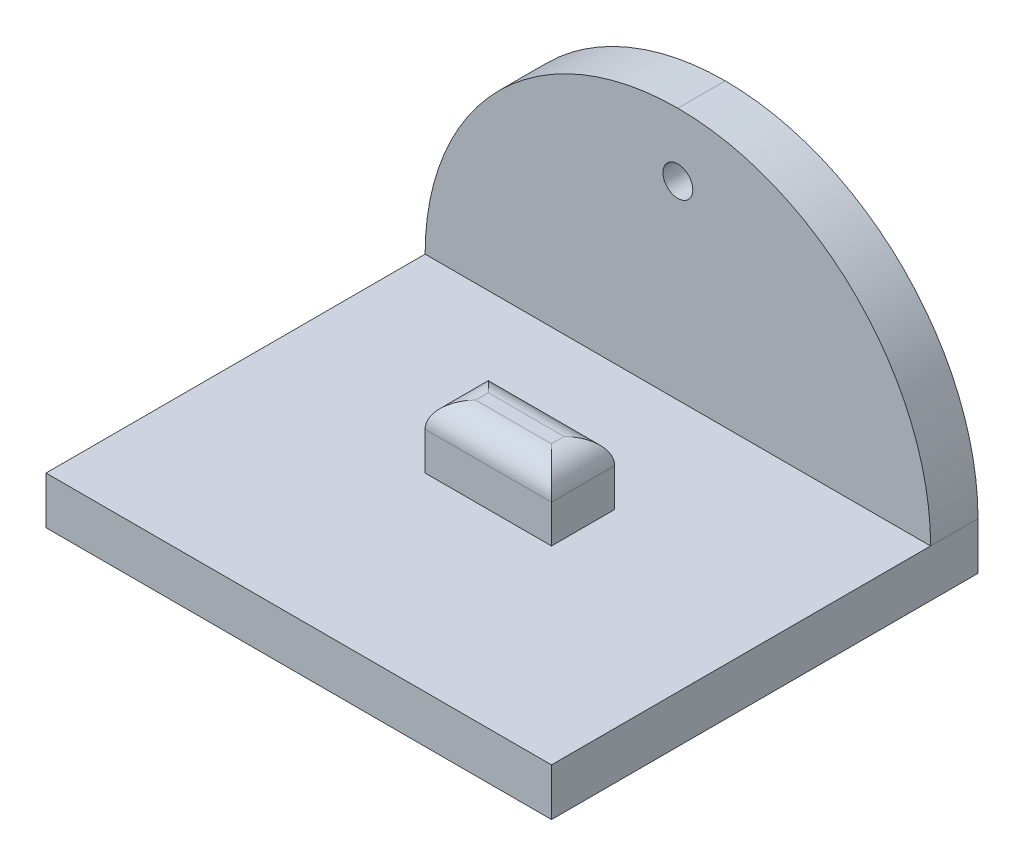
ISO-10303-21;
HEADER;
FILE_DESCRIPTION(('STEP AP214'),'2;1');
FILE_NAME('part.step','',(''),(''),'','','');
FILE_SCHEMA(('AUTOMOTIVE_DESIGN { 1 0 10303 214 1 1 1 1 }'));
ENDSEC;
DATA;
#1=APPLICATION_CONTEXT('core data for automotive mechanical design processes');
#2=APPLICATION_PROTOCOL_DEFINITION('international standard','automotive_design',2000,#1);
#3=PRODUCT_CONTEXT('',#1,'mechanical');
#4=PRODUCT('Part','Part','',(#3));
#5=PRODUCT_RELATED_PRODUCT_CATEGORY('part','',(#4));
#6=PRODUCT_DEFINITION_FORMATION('','',#4);
#7=PRODUCT_DEFINITION_CONTEXT('part definition',#1,'design');
#8=PRODUCT_DEFINITION('design','',#6,#7);
#9=PRODUCT_DEFINITION_SHAPE('','',#8);
#10=(LENGTH_UNIT() NAMED_UNIT(*) SI_UNIT(.MILLI.,.METRE.));
#11=(NAMED_UNIT(*) PLANE_ANGLE_UNIT() SI_UNIT($,.RADIAN.));
#12=(NAMED_UNIT(*) SI_UNIT($,.STERADIAN.) SOLID_ANGLE_UNIT());
#13=UNCERTAINTY_MEASURE_WITH_UNIT(LENGTH_MEASURE(1.E-05),#10,'distance_accuracy_value','');
#14=(GEOMETRIC_REPRESENTATION_CONTEXT(3) GLOBAL_UNCERTAINTY_ASSIGNED_CONTEXT((#13)) GLOBAL_UNIT_ASSIGNED_CONTEXT((#10,
#11,#12)) REPRESENTATION_CONTEXT('',''));
#15=CARTESIAN_POINT('',(0.,0.,0.));
#16=DIRECTION('',(0.,0.,1.));
#17=DIRECTION('',(1.,0.,0.));
#18=AXIS2_PLACEMENT_3D('',#15,#16,#17);
#19=CARTESIAN_POINT('',(50.8,4.7625,42.8625));
#20=DIRECTION('',(0.,-1.,0.));
#21=DIRECTION('',(0.,0.,-1.));
#22=AXIS2_PLACEMENT_3D('',#19,#20,#21);
#23=PLANE('',#22);
#24=DIRECTION('',(0.,0.,1.));
#25=VECTOR('',#24,1.);
#26=CARTESIAN_POINT('',(0.,4.7625,42.8625));
#27=LINE('',#26,#25);
#28=CARTESIAN_POINT('',(0.,4.7625,4.7625));
#29=VERTEX_POINT('',#28);
#30=CARTESIAN_POINT('',(0.,4.7625,42.8625));
#31=VERTEX_POINT('',#30);
#32=EDGE_CURVE('E189',#29,#31,#27,.T.);
#33=ORIENTED_EDGE('',*,*,#32,.T.);
#34=DIRECTION('',(-1.,0.,0.));
#35=VECTOR('',#34,1.);
#36=CARTESIAN_POINT('',(50.8,4.7625,42.8625));
#37=LINE('',#36,#35);
#38=CARTESIAN_POINT('',(50.8,4.7625,42.8625));
#39=VERTEX_POINT('',#38);
#40=EDGE_CURVE('E204',#39,#31,#37,.T.);
#41=ORIENTED_EDGE('',*,*,#40,.F.);
#42=DIRECTION('',(0.,0.,1.));
#43=VECTOR('',#42,1.);
#44=CARTESIAN_POINT('',(50.8,4.7625,42.8625));
#45=LINE('',#44,#43);
#46=CARTESIAN_POINT('',(50.8,4.7625,4.7625));
#47=VERTEX_POINT('',#46);
#48=EDGE_CURVE('E176',#47,#39,#45,.T.);
#49=ORIENTED_EDGE('',*,*,#48,.F.);
#50=DIRECTION('',(-1.,0.,0.));
#51=VECTOR('',#50,1.);
#52=CARTESIAN_POINT('',(50.8,4.7625,4.7625));
#53=LINE('',#52,#51);
#54=EDGE_CURVE('E208',#47,#29,#53,.T.);
#55=ORIENTED_EDGE('',*,*,#54,.T.);
#56=EDGE_LOOP('',(#33,#41,#49,#55));
#57=FACE_BOUND('',#56,.T.);
#58=DIRECTION('',(0.,0.,1.));
#59=VECTOR('',#58,1.);
#60=CARTESIAN_POINT('',(19.05,4.7625,23.8125));
#61=LINE('',#60,#59);
#62=CARTESIAN_POINT('',(19.05,4.7625,17.4625));
#63=VERTEX_POINT('',#62);
#64=CARTESIAN_POINT('',(19.05,4.7625,23.8125));
#65=VERTEX_POINT('',#64);
#66=EDGE_CURVE('E133',#63,#65,#61,.T.);
#67=ORIENTED_EDGE('',*,*,#66,.F.);
#68=DIRECTION('',(-1.,0.,0.));
#69=VECTOR('',#68,1.);
#70=CARTESIAN_POINT('',(19.05,4.7625,17.4625));
#71=LINE('',#70,#69);
#72=CARTESIAN_POINT('',(31.75,4.7625,17.4625));
#73=VERTEX_POINT('',#72);
#74=EDGE_CURVE('E142',#73,#63,#71,.T.);
#75=ORIENTED_EDGE('',*,*,#74,.F.);
#76=DIRECTION('',(0.,0.,-1.));
#77=VECTOR('',#76,1.);
#78=CARTESIAN_POINT('',(31.75,4.7625,23.8125));
#79=LINE('',#78,#77);
#80=CARTESIAN_POINT('',(31.75,4.7625,23.8125));
#81=VERTEX_POINT('',#80);
#82=EDGE_CURVE('E157',#81,#73,#79,.T.);
#83=ORIENTED_EDGE('',*,*,#82,.F.);
#84=DIRECTION('',(1.,0.,0.));
#85=VECTOR('',#84,1.);
#86=CARTESIAN_POINT('',(19.05,4.7625,23.8125));
#87=LINE('',#86,#85);
#88=EDGE_CURVE('E150',#65,#81,#87,.T.);
#89=ORIENTED_EDGE('',*,*,#88,.F.);
#90=EDGE_LOOP('',(#67,#75,#83,#89));
#91=FACE_BOUND('',#90,.T.);
#92=ADVANCED_FACE('F38',(#57,#91),#23,.F.);
#93=CARTESIAN_POINT('',(50.8,30.1625,0.));
#94=DIRECTION('',(0.,0.,1.));
#95=DIRECTION('',(0.,-1.,0.));
#96=AXIS2_PLACEMENT_3D('',#93,#94,#95);
#97=PLANE('',#96);
#98=CARTESIAN_POINT('',(25.4,23.8125,0.));
#99=DIRECTION('',(0.,0.,1.));
#100=DIRECTION('',(1.,0.,0.));
#101=AXIS2_PLACEMENT_3D('',#98,#99,#100);
#102=CIRCLE('',#101,1.499997);
#103=CARTESIAN_POINT('',(26.899997,23.8125,0.));
#104=VERTEX_POINT('',#103);
#105=EDGE_CURVE('E152',#104,#104,#102,.T.);
#106=ORIENTED_EDGE('',*,*,#105,.T.);
#107=EDGE_LOOP('',(#106));
#108=FACE_BOUND('',#107,.T.);
#109=CARTESIAN_POINT('',(25.4,4.7625,0.));
#110=DIRECTION('',(0.,0.,1.));
#111=DIRECTION('',(0.,-1.,0.));
#112=AXIS2_PLACEMENT_3D('',#109,#110,#111);
#113=CIRCLE('',#112,25.4);
#114=CARTESIAN_POINT('',(0.,4.7625,0.));
#115=VERTEX_POINT('',#114);
#116=CARTESIAN_POINT('',(25.4,30.1625,0.));
#117=VERTEX_POINT('',#116);
#118=EDGE_CURVE('E55',#115,#117,#113,.F.);
#119=ORIENTED_EDGE('',*,*,#118,.T.);
#120=CARTESIAN_POINT('',(25.4,4.7625,0.));
#121=DIRECTION('',(0.,0.,1.));
#122=DIRECTION('',(0.,-1.,0.));
#123=AXIS2_PLACEMENT_3D('',#120,#121,#122);
#124=CIRCLE('',#123,25.4);
#125=CARTESIAN_POINT('',(50.8,4.7625,0.));
#126=VERTEX_POINT('',#125);
#127=EDGE_CURVE('E48',#117,#126,#124,.F.);
#128=ORIENTED_EDGE('',*,*,#127,.T.);
#129=DIRECTION('',(0.,1.,0.));
#130=VECTOR('',#129,1.);
#131=CARTESIAN_POINT('',(50.8,30.1625,0.));
#132=LINE('',#131,#130);
#133=CARTESIAN_POINT('',(50.8,0.,0.));
#134=VERTEX_POINT('',#133);
#135=EDGE_CURVE('E172',#134,#126,#132,.T.);
#136=ORIENTED_EDGE('',*,*,#135,.F.);
#137=DIRECTION('',(-1.,0.,0.));
#138=VECTOR('',#137,1.);
#139=CARTESIAN_POINT('',(50.8,0.,0.));
#140=LINE('',#139,#138);
#141=CARTESIAN_POINT('',(0.,0.,0.));
#142=VERTEX_POINT('',#141);
#143=EDGE_CURVE('E186',#134,#142,#140,.T.);
#144=ORIENTED_EDGE('',*,*,#143,.T.);
#145=DIRECTION('',(0.,1.,0.));
#146=VECTOR('',#145,1.);
#147=CARTESIAN_POINT('',(0.,30.1625,0.));
#148=LINE('',#147,#146);
#149=EDGE_CURVE('E171',#142,#115,#148,.T.);
#150=ORIENTED_EDGE('',*,*,#149,.T.);
#151=EDGE_LOOP('',(#119,#128,#136,#144,#150));
#152=FACE_BOUND('',#151,.T.);
#153=ADVANCED_FACE('F266',(#108,#152),#97,.F.);
#154=CARTESIAN_POINT('',(50.8,4.7625,4.7625));
#155=DIRECTION('',(0.,0.,-1.));
#156=DIRECTION('',(0.,1.,0.));
#157=AXIS2_PLACEMENT_3D('',#154,#155,#156);
#158=PLANE('',#157);
#159=CARTESIAN_POINT('',(25.4,23.8125,4.7625));
#160=DIRECTION('',(0.,0.,1.));
#161=DIRECTION('',(1.,0.,0.));
#162=AXIS2_PLACEMENT_3D('',#159,#160,#161);
#163=CIRCLE('',#162,1.499997);
#164=CARTESIAN_POINT('',(26.899997,23.8125,4.7625));
#165=VERTEX_POINT('',#164);
#166=EDGE_CURVE('E251',#165,#165,#163,.T.);
#167=ORIENTED_EDGE('',*,*,#166,.F.);
#168=EDGE_LOOP('',(#167));
#169=FACE_BOUND('',#168,.T.);
#170=ORIENTED_EDGE('',*,*,#54,.F.);
#171=CARTESIAN_POINT('',(25.4,4.7625,4.7625));
#172=DIRECTION('',(0.,0.,-1.));
#173=DIRECTION('',(0.,1.,0.));
#174=AXIS2_PLACEMENT_3D('',#171,#172,#173);
#175=CIRCLE('',#174,25.4);
#176=CARTESIAN_POINT('',(25.4,30.1625,4.7625));
#177=VERTEX_POINT('',#176);
#178=EDGE_CURVE('E258',#47,#177,#175,.F.);
#179=ORIENTED_EDGE('',*,*,#178,.T.);
#180=CARTESIAN_POINT('',(25.4,4.7625,4.7625));
#181=DIRECTION('',(0.,0.,-1.));
#182=DIRECTION('',(0.,1.,0.));
#183=AXIS2_PLACEMENT_3D('',#180,#181,#182);
#184=CIRCLE('',#183,25.4);
#185=EDGE_CURVE('E255',#177,#29,#184,.F.);
#186=ORIENTED_EDGE('',*,*,#185,.T.);
#187=EDGE_LOOP('',(#170,#179,#186));
#188=FACE_BOUND('',#187,.T.);
#189=ADVANCED_FACE('F278',(#169,#188),#158,.F.);
#190=CARTESIAN_POINT('',(50.8,0.,42.8625));
#191=DIRECTION('',(0.,0.,-1.));
#192=DIRECTION('',(-1.,0.,0.));
#193=AXIS2_PLACEMENT_3D('',#190,#191,#192);
#194=PLANE('',#193);
#195=DIRECTION('',(0.,-1.,0.));
#196=VECTOR('',#195,1.);
#197=CARTESIAN_POINT('',(0.,0.,42.8625));
#198=LINE('',#197,#196);
#199=CARTESIAN_POINT('',(0.,0.,42.8625));
#200=VERTEX_POINT('',#199);
#201=EDGE_CURVE('E192',#31,#200,#198,.T.);
#202=ORIENTED_EDGE('',*,*,#201,.T.);
#203=DIRECTION('',(-1.,0.,0.));
#204=VECTOR('',#203,1.);
#205=CARTESIAN_POINT('',(50.8,0.,42.8625));
#206=LINE('',#205,#204);
#207=CARTESIAN_POINT('',(50.8,0.,42.8625));
#208=VERTEX_POINT('',#207);
#209=EDGE_CURVE('E200',#208,#200,#206,.T.);
#210=ORIENTED_EDGE('',*,*,#209,.F.);
#211=DIRECTION('',(0.,-1.,0.));
#212=VECTOR('',#211,1.);
#213=CARTESIAN_POINT('',(50.8,0.,42.8625));
#214=LINE('',#213,#212);
#215=EDGE_CURVE('E180',#39,#208,#214,.T.);
#216=ORIENTED_EDGE('',*,*,#215,.F.);
#217=ORIENTED_EDGE('',*,*,#40,.T.);
#218=EDGE_LOOP('',(#202,#210,#216,#217));
#219=FACE_BOUND('',#218,.T.);
#220=ADVANCED_FACE('F335',(#219),#194,.F.);
#221=CARTESIAN_POINT('',(50.8,0.,0.));
#222=DIRECTION('',(0.,1.,0.));
#223=DIRECTION('',(0.,0.,1.));
#224=AXIS2_PLACEMENT_3D('',#221,#222,#223);
#225=PLANE('',#224);
#226=DIRECTION('',(0.,0.,-1.));
#227=VECTOR('',#226,1.);
#228=CARTESIAN_POINT('',(0.,0.,0.));
#229=LINE('',#228,#227);
#230=EDGE_CURVE('E177',#200,#142,#229,.T.);
#231=ORIENTED_EDGE('',*,*,#230,.T.);
#232=ORIENTED_EDGE('',*,*,#143,.F.);
#233=DIRECTION('',(0.,0.,-1.));
#234=VECTOR('',#233,1.);
#235=CARTESIAN_POINT('',(50.8,0.,0.));
#236=LINE('',#235,#234);
#237=EDGE_CURVE('E183',#208,#134,#236,.T.);
#238=ORIENTED_EDGE('',*,*,#237,.F.);
#239=ORIENTED_EDGE('',*,*,#209,.T.);
#240=EDGE_LOOP('',(#231,#232,#238,#239));
#241=FACE_BOUND('',#240,.T.);
#242=ADVANCED_FACE('F380',(#241),#225,.F.);
#243=CARTESIAN_POINT('',(50.8,0.,0.));
#244=DIRECTION('',(-1.,0.,0.));
#245=DIRECTION('',(0.,0.,1.));
#246=AXIS2_PLACEMENT_3D('',#243,#244,#245);
#247=PLANE('',#246);
#248=ORIENTED_EDGE('',*,*,#135,.T.);
#249=DIRECTION('',(0.,0.,1.));
#250=VECTOR('',#249,1.);
#251=CARTESIAN_POINT('',(50.8,4.7625,0.));
#252=LINE('',#251,#250);
#253=EDGE_CURVE('E236',#126,#47,#252,.T.);
#254=ORIENTED_EDGE('',*,*,#253,.T.);
#255=ORIENTED_EDGE('',*,*,#48,.T.);
#256=ORIENTED_EDGE('',*,*,#215,.T.);
#257=ORIENTED_EDGE('',*,*,#237,.T.);
#258=EDGE_LOOP('',(#248,#254,#255,#256,#257));
#259=FACE_BOUND('',#258,.T.);
#260=ADVANCED_FACE('F271',(#259),#247,.F.);
#261=CARTESIAN_POINT('',(0.,0.,0.));
#262=DIRECTION('',(-1.,0.,0.));
#263=DIRECTION('',(0.,0.,1.));
#264=AXIS2_PLACEMENT_3D('',#261,#262,#263);
#265=PLANE('',#264);
#266=ORIENTED_EDGE('',*,*,#32,.F.);
#267=DIRECTION('',(0.,0.,1.));
#268=VECTOR('',#267,1.);
#269=CARTESIAN_POINT('',(0.,4.7625,0.));
#270=LINE('',#269,#268);
#271=EDGE_CURVE('E11',#29,#115,#270,.F.);
#272=ORIENTED_EDGE('',*,*,#271,.T.);
#273=ORIENTED_EDGE('',*,*,#149,.F.);
#274=ORIENTED_EDGE('',*,*,#230,.F.);
#275=ORIENTED_EDGE('',*,*,#201,.F.);
#276=EDGE_LOOP('',(#266,#272,#273,#274,#275));
#277=FACE_BOUND('',#276,.T.);
#278=ADVANCED_FACE('F389',(#277),#265,.T.);
#279=CARTESIAN_POINT('',(19.05,11.1125,23.8125));
#280=DIRECTION('',(1.,0.,0.));
#281=DIRECTION('',(0.,0.,-1.));
#282=AXIS2_PLACEMENT_3D('',#279,#280,#281);
#283=PLANE('',#282);
#284=DIRECTION('',(0.,-1.,0.));
#285=VECTOR('',#284,1.);
#286=CARTESIAN_POINT('',(19.05,11.1125,23.8125));
#287=LINE('',#286,#285);
#288=CARTESIAN_POINT('',(19.05,8.5725,23.8125));
#289=VERTEX_POINT('',#288);
#290=EDGE_CURVE('E168',#289,#65,#287,.T.);
#291=ORIENTED_EDGE('',*,*,#290,.F.);
#292=DIRECTION('',(0.,0.,1.));
#293=VECTOR('',#292,1.);
#294=CARTESIAN_POINT('',(19.05,8.5725,23.8125));
#295=LINE('',#294,#293);
#296=CARTESIAN_POINT('',(19.05,8.5725,17.4625));
#297=VERTEX_POINT('',#296);
#298=EDGE_CURVE('E135',#289,#297,#295,.F.);
#299=ORIENTED_EDGE('',*,*,#298,.T.);
#300=DIRECTION('',(0.,-1.,0.));
#301=VECTOR('',#300,1.);
#302=CARTESIAN_POINT('',(19.05,11.1125,17.4625));
#303=LINE('',#302,#301);
#304=EDGE_CURVE('E129',#297,#63,#303,.T.);
#305=ORIENTED_EDGE('',*,*,#304,.T.);
#306=ORIENTED_EDGE('',*,*,#66,.T.);
#307=EDGE_LOOP('',(#291,#299,#305,#306));
#308=FACE_BOUND('',#307,.T.);
#309=ADVANCED_FACE('F132',(#308),#283,.F.);
#310=CARTESIAN_POINT('',(19.05,11.1125,23.8125));
#311=DIRECTION('',(0.,0.,-1.));
#312=DIRECTION('',(0.,1.,0.));
#313=AXIS2_PLACEMENT_3D('',#310,#311,#312);
#314=PLANE('',#313);
#315=DIRECTION('',(0.,-1.,0.));
#316=VECTOR('',#315,1.);
#317=CARTESIAN_POINT('',(31.75,11.1125,23.8125));
#318=LINE('',#317,#316);
#319=CARTESIAN_POINT('',(31.75,8.5725,23.8125));
#320=VERTEX_POINT('',#319);
#321=EDGE_CURVE('E165',#320,#81,#318,.T.);
#322=ORIENTED_EDGE('',*,*,#321,.F.);
#323=DIRECTION('',(1.,0.,0.));
#324=VECTOR('',#323,1.);
#325=CARTESIAN_POINT('',(19.05,8.5725,23.8125));
#326=LINE('',#325,#324);
#327=EDGE_CURVE('E231',#320,#289,#326,.F.);
#328=ORIENTED_EDGE('',*,*,#327,.T.);
#329=ORIENTED_EDGE('',*,*,#290,.T.);
#330=ORIENTED_EDGE('',*,*,#88,.T.);
#331=EDGE_LOOP('',(#322,#328,#329,#330));
#332=FACE_BOUND('',#331,.T.);
#333=ADVANCED_FACE('F291',(#332),#314,.F.);
#334=CARTESIAN_POINT('',(31.75,11.1125,23.8125));
#335=DIRECTION('',(-1.,0.,0.));
#336=DIRECTION('',(0.,0.,1.));
#337=AXIS2_PLACEMENT_3D('',#334,#335,#336);
#338=PLANE('',#337);
#339=DIRECTION('',(0.,-1.,0.));
#340=VECTOR('',#339,1.);
#341=CARTESIAN_POINT('',(31.75,11.1125,17.4625));
#342=LINE('',#341,#340);
#343=CARTESIAN_POINT('',(31.75,8.5725,17.4625));
#344=VERTEX_POINT('',#343);
#345=EDGE_CURVE('E141',#344,#73,#342,.T.);
#346=ORIENTED_EDGE('',*,*,#345,.F.);
#347=DIRECTION('',(0.,0.,-1.));
#348=VECTOR('',#347,1.);
#349=CARTESIAN_POINT('',(31.75,8.5725,23.8125));
#350=LINE('',#349,#348);
#351=EDGE_CURVE('E228',#344,#320,#350,.F.);
#352=ORIENTED_EDGE('',*,*,#351,.T.);
#353=ORIENTED_EDGE('',*,*,#321,.T.);
#354=ORIENTED_EDGE('',*,*,#82,.T.);
#355=EDGE_LOOP('',(#346,#352,#353,#354));
#356=FACE_BOUND('',#355,.T.);
#357=ADVANCED_FACE('F308',(#356),#338,.F.);
#358=CARTESIAN_POINT('',(19.05,11.1125,17.4625));
#359=DIRECTION('',(0.,0.,1.));
#360=DIRECTION('',(0.,-1.,0.));
#361=AXIS2_PLACEMENT_3D('',#358,#359,#360);
#362=PLANE('',#361);
#363=ORIENTED_EDGE('',*,*,#304,.F.);
#364=DIRECTION('',(-1.,0.,0.));
#365=VECTOR('',#364,1.);
#366=CARTESIAN_POINT('',(19.05,8.5725,17.4625));
#367=LINE('',#366,#365);
#368=EDGE_CURVE('E225',#297,#344,#367,.F.);
#369=ORIENTED_EDGE('',*,*,#368,.T.);
#370=ORIENTED_EDGE('',*,*,#345,.T.);
#371=ORIENTED_EDGE('',*,*,#74,.T.);
#372=EDGE_LOOP('',(#363,#369,#370,#371));
#373=FACE_BOUND('',#372,.T.);
#374=ADVANCED_FACE('F154',(#373),#362,.F.);
#375=CARTESIAN_POINT('',(0.,11.1125,0.));
#376=DIRECTION('',(0.,-1.,0.));
#377=DIRECTION('',(0.,0.,-1.));
#378=AXIS2_PLACEMENT_3D('',#375,#376,#377);
#379=PLANE('',#378);
#380=DIRECTION('',(0.,0.,-1.));
#381=VECTOR('',#380,1.);
#382=CARTESIAN_POINT('',(29.21,11.1125,0.));
#383=LINE('',#382,#381);
#384=CARTESIAN_POINT('',(29.21,11.1125,21.2725));
#385=VERTEX_POINT('',#384);
#386=CARTESIAN_POINT('',(29.21,11.1125,20.0025));
#387=VERTEX_POINT('',#386);
#388=EDGE_CURVE('E218',#385,#387,#383,.T.);
#389=ORIENTED_EDGE('',*,*,#388,.T.);
#390=DIRECTION('',(-1.,0.,0.));
#391=VECTOR('',#390,1.);
#392=CARTESIAN_POINT('',(0.,11.1125,20.0025));
#393=LINE('',#392,#391);
#394=CARTESIAN_POINT('',(21.59,11.1125,20.0025));
#395=VERTEX_POINT('',#394);
#396=EDGE_CURVE('E221',#387,#395,#393,.T.);
#397=ORIENTED_EDGE('',*,*,#396,.T.);
#398=DIRECTION('',(0.,0.,1.));
#399=VECTOR('',#398,1.);
#400=CARTESIAN_POINT('',(21.59,11.1125,0.));
#401=LINE('',#400,#399);
#402=CARTESIAN_POINT('',(21.59,11.1125,21.2725));
#403=VERTEX_POINT('',#402);
#404=EDGE_CURVE('E212',#395,#403,#401,.T.);
#405=ORIENTED_EDGE('',*,*,#404,.T.);
#406=DIRECTION('',(1.,0.,0.));
#407=VECTOR('',#406,1.);
#408=CARTESIAN_POINT('',(0.,11.1125,21.2725));
#409=LINE('',#408,#407);
#410=EDGE_CURVE('E215',#403,#385,#409,.T.);
#411=ORIENTED_EDGE('',*,*,#410,.T.);
#412=EDGE_LOOP('',(#389,#397,#405,#411));
#413=FACE_BOUND('',#412,.T.);
#414=ADVANCED_FACE('F313',(#413),#379,.F.);
#415=CARTESIAN_POINT('',(25.4,23.8125,0.));
#416=DIRECTION('',(0.,0.,1.));
#417=DIRECTION('',(1.,0.,0.));
#418=AXIS2_PLACEMENT_3D('',#415,#416,#417);
#419=CYLINDRICAL_SURFACE('',#418,1.499997);
#420=ORIENTED_EDGE('',*,*,#105,.F.);
#421=EDGE_LOOP('',(#420));
#422=FACE_BOUND('',#421,.T.);
#423=ORIENTED_EDGE('',*,*,#166,.T.);
#424=EDGE_LOOP('',(#423));
#425=FACE_BOUND('',#424,.T.);
#426=ADVANCED_FACE('F315',(#422,#425),#419,.F.);
#427=CARTESIAN_POINT('',(0.,8.5725,21.2725));
#428=DIRECTION('',(1.,0.,0.));
#429=DIRECTION('',(0.,0.,-1.));
#430=AXIS2_PLACEMENT_3D('',#427,#428,#429);
#431=CYLINDRICAL_SURFACE('',#430,2.54);
#432=CARTESIAN_POINT('',(21.59,8.5725,21.2725));
#433=DIRECTION('',(0.707106781186547,0.,0.707106781186547));
#434=DIRECTION('',(-0.707106781186547,0.,0.707106781186547));
#435=AXIS2_PLACEMENT_3D('',#432,#433,#434);
#436=ELLIPSE('',#435,3.59210244842766,2.54);
#437=EDGE_CURVE('E243',#289,#403,#436,.F.);
#438=ORIENTED_EDGE('',*,*,#437,.F.);
#439=ORIENTED_EDGE('',*,*,#327,.F.);
#440=CARTESIAN_POINT('',(29.21,8.5725,21.2725));
#441=DIRECTION('',(0.707106781186547,0.,-0.707106781186547));
#442=DIRECTION('',(0.707106781186547,0.,0.707106781186547));
#443=AXIS2_PLACEMENT_3D('',#440,#441,#442);
#444=ELLIPSE('',#443,3.59210244842766,2.54);
#445=EDGE_CURVE('E247',#385,#320,#444,.T.);
#446=ORIENTED_EDGE('',*,*,#445,.F.);
#447=ORIENTED_EDGE('',*,*,#410,.F.);
#448=EDGE_LOOP('',(#438,#439,#446,#447));
#449=FACE_BOUND('',#448,.T.);
#450=ADVANCED_FACE('F296',(#449),#431,.T.);
#451=CARTESIAN_POINT('',(29.21,8.5725,0.));
#452=DIRECTION('',(0.,0.,-1.));
#453=DIRECTION('',(-1.,0.,0.));
#454=AXIS2_PLACEMENT_3D('',#451,#452,#453);
#455=CYLINDRICAL_SURFACE('',#454,2.54);
#456=ORIENTED_EDGE('',*,*,#445,.T.);
#457=ORIENTED_EDGE('',*,*,#351,.F.);
#458=CARTESIAN_POINT('',(29.21,8.5725,20.0025));
#459=DIRECTION('',(-0.707106781186547,0.,-0.707106781186547));
#460=DIRECTION('',(0.707106781186547,0.,-0.707106781186547));
#461=AXIS2_PLACEMENT_3D('',#458,#459,#460);
#462=ELLIPSE('',#461,3.59210244842766,2.54);
#463=EDGE_CURVE('E240',#387,#344,#462,.T.);
#464=ORIENTED_EDGE('',*,*,#463,.F.);
#465=ORIENTED_EDGE('',*,*,#388,.F.);
#466=EDGE_LOOP('',(#456,#457,#464,#465));
#467=FACE_BOUND('',#466,.T.);
#468=ADVANCED_FACE('F310',(#467),#455,.T.);
#469=CARTESIAN_POINT('',(21.59,8.5725,0.));
#470=DIRECTION('',(0.,0.,1.));
#471=DIRECTION('',(1.,0.,0.));
#472=AXIS2_PLACEMENT_3D('',#469,#470,#471);
#473=CYLINDRICAL_SURFACE('',#472,2.54);
#474=ORIENTED_EDGE('',*,*,#437,.T.);
#475=ORIENTED_EDGE('',*,*,#404,.F.);
#476=CARTESIAN_POINT('',(21.59,8.5725,20.0025));
#477=DIRECTION('',(-0.707106781186547,0.,0.707106781186547));
#478=DIRECTION('',(0.707106781186547,0.,0.707106781186547));
#479=AXIS2_PLACEMENT_3D('',#476,#477,#478);
#480=ELLIPSE('',#479,3.59210244842766,2.54);
#481=EDGE_CURVE('E237',#297,#395,#480,.F.);
#482=ORIENTED_EDGE('',*,*,#481,.F.);
#483=ORIENTED_EDGE('',*,*,#298,.F.);
#484=EDGE_LOOP('',(#474,#475,#482,#483));
#485=FACE_BOUND('',#484,.T.);
#486=ADVANCED_FACE('F301',(#485),#473,.T.);
#487=CARTESIAN_POINT('',(0.,8.5725,20.0025));
#488=DIRECTION('',(-1.,0.,0.));
#489=DIRECTION('',(0.,0.,1.));
#490=AXIS2_PLACEMENT_3D('',#487,#488,#489);
#491=CYLINDRICAL_SURFACE('',#490,2.54);
#492=ORIENTED_EDGE('',*,*,#463,.T.);
#493=ORIENTED_EDGE('',*,*,#368,.F.);
#494=ORIENTED_EDGE('',*,*,#481,.T.);
#495=ORIENTED_EDGE('',*,*,#396,.F.);
#496=EDGE_LOOP('',(#492,#493,#494,#495));
#497=FACE_BOUND('',#496,.T.);
#498=ADVANCED_FACE('F304',(#497),#491,.T.);
#499=CARTESIAN_POINT('',(25.4,4.7625,4.7625));
#500=DIRECTION('',(0.,0.,-1.));
#501=DIRECTION('',(-1.,0.,0.));
#502=AXIS2_PLACEMENT_3D('',#499,#500,#501);
#503=CYLINDRICAL_SURFACE('',#502,25.4);
#504=DIRECTION('',(0.,0.,1.));
#505=VECTOR('',#504,1.);
#506=CARTESIAN_POINT('',(25.4,30.1625,4.7625));
#507=LINE('',#506,#505);
#508=EDGE_CURVE('E42',#117,#177,#507,.T.);
#509=ORIENTED_EDGE('',*,*,#508,.F.);
#510=ORIENTED_EDGE('',*,*,#118,.F.);
#511=ORIENTED_EDGE('',*,*,#271,.F.);
#512=ORIENTED_EDGE('',*,*,#185,.F.);
#513=EDGE_LOOP('',(#509,#510,#511,#512));
#514=FACE_BOUND('',#513,.T.);
#515=ADVANCED_FACE('F40',(#514),#503,.T.);
#516=CARTESIAN_POINT('',(25.4,4.7625,0.));
#517=DIRECTION('',(0.,0.,1.));
#518=DIRECTION('',(1.,0.,0.));
#519=AXIS2_PLACEMENT_3D('',#516,#517,#518);
#520=CYLINDRICAL_SURFACE('',#519,25.4);
#521=ORIENTED_EDGE('',*,*,#127,.F.);
#522=ORIENTED_EDGE('',*,*,#508,.T.);
#523=ORIENTED_EDGE('',*,*,#178,.F.);
#524=ORIENTED_EDGE('',*,*,#253,.F.);
#525=EDGE_LOOP('',(#521,#522,#523,#524));
#526=FACE_BOUND('',#525,.T.);
#527=ADVANCED_FACE('F275',(#526),#520,.T.);
#528=CLOSED_SHELL('',(#92,#153,#189,#220,#242,#260,#278,#309,#333,#357,#374,#414,#426,#450,#468,
#486,#498,#515,#527));
#529=MANIFOLD_SOLID_BREP('B2',#528);
#530=ADVANCED_BREP_SHAPE_REPRESENTATION('',(#18,#529),#14);
#531=SHAPE_DEFINITION_REPRESENTATION(#9,#530);
ENDSEC;
END-ISO-10303-21;
